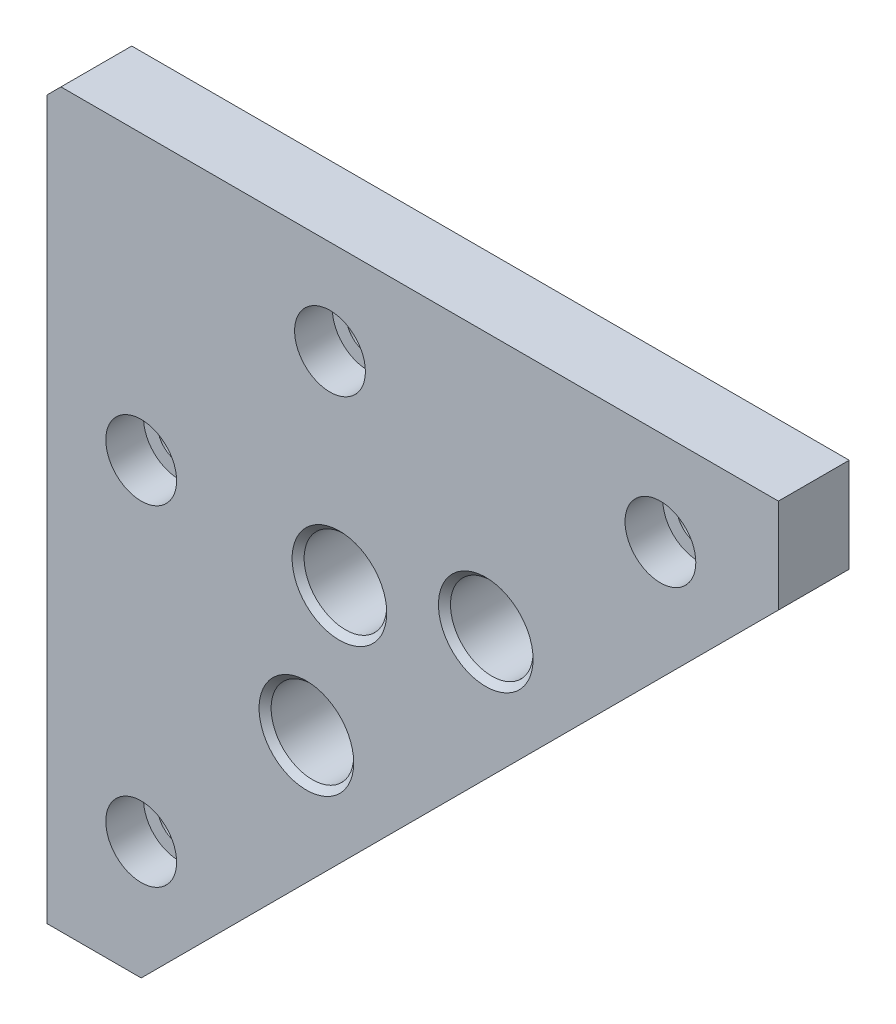
ISO-10303-21;
HEADER;
FILE_DESCRIPTION(('STEP AP214'),'2;1');
FILE_NAME('part.step','',(''),(''),'','','');
FILE_SCHEMA(('AUTOMOTIVE_DESIGN { 1 0 10303 214 1 1 1 1 }'));
ENDSEC;
DATA;
#1=APPLICATION_CONTEXT('core data for automotive mechanical design processes');
#2=APPLICATION_PROTOCOL_DEFINITION('international standard','automotive_design',2000,#1);
#3=PRODUCT_CONTEXT('',#1,'mechanical');
#4=PRODUCT('Part','Part','',(#3));
#5=PRODUCT_RELATED_PRODUCT_CATEGORY('part','',(#4));
#6=PRODUCT_DEFINITION_FORMATION('','',#4);
#7=PRODUCT_DEFINITION_CONTEXT('part definition',#1,'design');
#8=PRODUCT_DEFINITION('design','',#6,#7);
#9=PRODUCT_DEFINITION_SHAPE('','',#8);
#10=(LENGTH_UNIT() NAMED_UNIT(*) SI_UNIT(.MILLI.,.METRE.));
#11=(NAMED_UNIT(*) PLANE_ANGLE_UNIT() SI_UNIT($,.RADIAN.));
#12=(NAMED_UNIT(*) SI_UNIT($,.STERADIAN.) SOLID_ANGLE_UNIT());
#13=UNCERTAINTY_MEASURE_WITH_UNIT(LENGTH_MEASURE(1.E-05),#10,'distance_accuracy_value','');
#14=(GEOMETRIC_REPRESENTATION_CONTEXT(3) GLOBAL_UNCERTAINTY_ASSIGNED_CONTEXT((#13)) GLOBAL_UNIT_ASSIGNED_CONTEXT((#10,
#11,#12)) REPRESENTATION_CONTEXT('',''));
#15=CARTESIAN_POINT('',(0.,0.,0.));
#16=DIRECTION('',(0.,0.,1.));
#17=DIRECTION('',(1.,0.,0.));
#18=AXIS2_PLACEMENT_3D('',#15,#16,#17);
#19=CARTESIAN_POINT('',(60.,135.,0.));
#20=DIRECTION('',(0.,0.,1.));
#21=DIRECTION('',(1.,0.,0.));
#22=AXIS2_PLACEMENT_3D('',#19,#20,#21);
#23=CYLINDRICAL_SURFACE('',#22,4.50000000000001);
#24=CARTESIAN_POINT('',(60.,135.,0.));
#25=DIRECTION('',(0.,0.,1.));
#26=DIRECTION('',(1.,0.,0.));
#27=AXIS2_PLACEMENT_3D('',#24,#25,#26);
#28=CIRCLE('',#27,4.50000000000001);
#29=CARTESIAN_POINT('',(64.5,135.,0.));
#30=VERTEX_POINT('',#29);
#31=EDGE_CURVE('E202',#30,#30,#28,.T.);
#32=ORIENTED_EDGE('',*,*,#31,.F.);
#33=EDGE_LOOP('',(#32));
#34=FACE_BOUND('',#33,.T.);
#35=CARTESIAN_POINT('',(60.,135.,7.));
#36=DIRECTION('',(0.,0.,1.));
#37=DIRECTION('',(1.,0.,0.));
#38=AXIS2_PLACEMENT_3D('',#35,#36,#37);
#39=CIRCLE('',#38,4.50000000000001);
#40=CARTESIAN_POINT('',(64.5,135.,7.));
#41=VERTEX_POINT('',#40);
#42=EDGE_CURVE('E57',#41,#41,#39,.F.);
#43=ORIENTED_EDGE('',*,*,#42,.F.);
#44=EDGE_LOOP('',(#43));
#45=FACE_BOUND('',#44,.T.);
#46=ADVANCED_FACE('F53',(#34,#45),#23,.F.);
#47=CARTESIAN_POINT('',(20.,95.,0.));
#48=DIRECTION('',(0.,0.,1.));
#49=DIRECTION('',(1.,0.,0.));
#50=AXIS2_PLACEMENT_3D('',#47,#48,#49);
#51=CYLINDRICAL_SURFACE('',#50,4.5);
#52=CARTESIAN_POINT('',(20.,95.,0.));
#53=DIRECTION('',(0.,0.,1.));
#54=DIRECTION('',(1.,0.,0.));
#55=AXIS2_PLACEMENT_3D('',#52,#53,#54);
#56=CIRCLE('',#55,4.5);
#57=CARTESIAN_POINT('',(24.5,95.,0.));
#58=VERTEX_POINT('',#57);
#59=EDGE_CURVE('E198',#58,#58,#56,.T.);
#60=ORIENTED_EDGE('',*,*,#59,.F.);
#61=EDGE_LOOP('',(#60));
#62=FACE_BOUND('',#61,.T.);
#63=CARTESIAN_POINT('',(20.,95.,7.));
#64=DIRECTION('',(0.,0.,1.));
#65=DIRECTION('',(1.,0.,0.));
#66=AXIS2_PLACEMENT_3D('',#63,#64,#65);
#67=CIRCLE('',#66,4.5);
#68=CARTESIAN_POINT('',(24.5,95.,7.));
#69=VERTEX_POINT('',#68);
#70=EDGE_CURVE('E180',#69,#69,#67,.F.);
#71=ORIENTED_EDGE('',*,*,#70,.F.);
#72=EDGE_LOOP('',(#71));
#73=FACE_BOUND('',#72,.T.);
#74=ADVANCED_FACE('F317',(#62,#73),#51,.F.);
#75=CARTESIAN_POINT('',(130.,135.,0.));
#76=DIRECTION('',(0.,0.,1.));
#77=DIRECTION('',(1.,0.,0.));
#78=AXIS2_PLACEMENT_3D('',#75,#76,#77);
#79=CYLINDRICAL_SURFACE('',#78,4.49999999999999);
#80=CARTESIAN_POINT('',(130.,135.,0.));
#81=DIRECTION('',(0.,0.,1.));
#82=DIRECTION('',(1.,0.,0.));
#83=AXIS2_PLACEMENT_3D('',#80,#81,#82);
#84=CIRCLE('',#83,4.49999999999999);
#85=CARTESIAN_POINT('',(134.5,135.,0.));
#86=VERTEX_POINT('',#85);
#87=EDGE_CURVE('E192',#86,#86,#84,.T.);
#88=ORIENTED_EDGE('',*,*,#87,.F.);
#89=EDGE_LOOP('',(#88));
#90=FACE_BOUND('',#89,.T.);
#91=CARTESIAN_POINT('',(130.,135.,7.));
#92=DIRECTION('',(0.,0.,1.));
#93=DIRECTION('',(1.,0.,0.));
#94=AXIS2_PLACEMENT_3D('',#91,#92,#93);
#95=CIRCLE('',#94,4.49999999999999);
#96=CARTESIAN_POINT('',(134.5,135.,7.));
#97=VERTEX_POINT('',#96);
#98=EDGE_CURVE('E176',#97,#97,#95,.F.);
#99=ORIENTED_EDGE('',*,*,#98,.F.);
#100=EDGE_LOOP('',(#99));
#101=FACE_BOUND('',#100,.T.);
#102=ADVANCED_FACE('F324',(#90,#101),#79,.F.);
#103=CARTESIAN_POINT('',(20.,25.,0.));
#104=DIRECTION('',(0.,0.,1.));
#105=DIRECTION('',(1.,0.,0.));
#106=AXIS2_PLACEMENT_3D('',#103,#104,#105);
#107=CYLINDRICAL_SURFACE('',#106,4.5);
#108=CARTESIAN_POINT('',(20.,25.,0.));
#109=DIRECTION('',(0.,0.,1.));
#110=DIRECTION('',(1.,0.,0.));
#111=AXIS2_PLACEMENT_3D('',#108,#109,#110);
#112=CIRCLE('',#111,4.5);
#113=CARTESIAN_POINT('',(24.5,25.,0.));
#114=VERTEX_POINT('',#113);
#115=EDGE_CURVE('E187',#114,#114,#112,.T.);
#116=ORIENTED_EDGE('',*,*,#115,.F.);
#117=EDGE_LOOP('',(#116));
#118=FACE_BOUND('',#117,.T.);
#119=CARTESIAN_POINT('',(20.,25.,7.));
#120=DIRECTION('',(0.,0.,1.));
#121=DIRECTION('',(1.,0.,0.));
#122=AXIS2_PLACEMENT_3D('',#119,#120,#121);
#123=CIRCLE('',#122,4.5);
#124=CARTESIAN_POINT('',(24.5,25.,7.));
#125=VERTEX_POINT('',#124);
#126=EDGE_CURVE('E172',#125,#125,#123,.F.);
#127=ORIENTED_EDGE('',*,*,#126,.F.);
#128=EDGE_LOOP('',(#127));
#129=FACE_BOUND('',#128,.T.);
#130=ADVANCED_FACE('F331',(#118,#129),#107,.F.);
#131=CARTESIAN_POINT('',(0.,0.,15.));
#132=DIRECTION('',(1.,0.,0.));
#133=DIRECTION('',(0.,0.,-1.));
#134=AXIS2_PLACEMENT_3D('',#131,#132,#133);
#135=PLANE('',#134);
#136=DIRECTION('',(0.,-1.,0.));
#137=VECTOR('',#136,1.);
#138=CARTESIAN_POINT('',(0.,0.,0.));
#139=LINE('',#138,#137);
#140=CARTESIAN_POINT('',(0.,152.,0.));
#141=VERTEX_POINT('',#140);
#142=CARTESIAN_POINT('',(0.,0.,0.));
#143=VERTEX_POINT('',#142);
#144=EDGE_CURVE('E145',#141,#143,#139,.T.);
#145=ORIENTED_EDGE('',*,*,#144,.T.);
#146=DIRECTION('',(0.,0.,-1.));
#147=VECTOR('',#146,1.);
#148=CARTESIAN_POINT('',(0.,0.,15.));
#149=LINE('',#148,#147);
#150=CARTESIAN_POINT('',(0.,0.,15.));
#151=VERTEX_POINT('',#150);
#152=EDGE_CURVE('E11',#151,#143,#149,.T.);
#153=ORIENTED_EDGE('',*,*,#152,.F.);
#154=DIRECTION('',(0.,-1.,0.));
#155=VECTOR('',#154,1.);
#156=CARTESIAN_POINT('',(0.,0.,15.));
#157=LINE('',#156,#155);
#158=CARTESIAN_POINT('',(0.,152.,15.));
#159=VERTEX_POINT('',#158);
#160=EDGE_CURVE('E162',#159,#151,#157,.T.);
#161=ORIENTED_EDGE('',*,*,#160,.F.);
#162=DIRECTION('',(0.,0.,-1.));
#163=VECTOR('',#162,1.);
#164=CARTESIAN_POINT('',(0.,152.,15.));
#165=LINE('',#164,#163);
#166=EDGE_CURVE('E141',#159,#141,#165,.T.);
#167=ORIENTED_EDGE('',*,*,#166,.T.);
#168=EDGE_LOOP('',(#145,#153,#161,#167));
#169=FACE_BOUND('',#168,.T.);
#170=ADVANCED_FACE('F55',(#169),#135,.F.);
#171=CARTESIAN_POINT('',(0.,0.,15.));
#172=DIRECTION('',(0.,1.,0.));
#173=DIRECTION('',(0.,0.,1.));
#174=AXIS2_PLACEMENT_3D('',#171,#172,#173);
#175=PLANE('',#174);
#176=DIRECTION('',(1.,0.,0.));
#177=VECTOR('',#176,1.);
#178=CARTESIAN_POINT('',(0.,0.,0.));
#179=LINE('',#178,#177);
#180=CARTESIAN_POINT('',(20.,0.,0.));
#181=VERTEX_POINT('',#180);
#182=EDGE_CURVE('E149',#143,#181,#179,.T.);
#183=ORIENTED_EDGE('',*,*,#182,.T.);
#184=DIRECTION('',(0.,0.,-1.));
#185=VECTOR('',#184,1.);
#186=CARTESIAN_POINT('',(20.,0.,15.));
#187=LINE('',#186,#185);
#188=CARTESIAN_POINT('',(20.,0.,15.));
#189=VERTEX_POINT('',#188);
#190=EDGE_CURVE('E64',#189,#181,#187,.T.);
#191=ORIENTED_EDGE('',*,*,#190,.F.);
#192=DIRECTION('',(1.,0.,0.));
#193=VECTOR('',#192,1.);
#194=CARTESIAN_POINT('',(0.,0.,15.));
#195=LINE('',#194,#193);
#196=EDGE_CURVE('E110',#151,#189,#195,.T.);
#197=ORIENTED_EDGE('',*,*,#196,.F.);
#198=ORIENTED_EDGE('',*,*,#152,.T.);
#199=EDGE_LOOP('',(#183,#191,#197,#198));
#200=FACE_BOUND('',#199,.T.);
#201=ADVANCED_FACE('F446',(#200),#175,.F.);
#202=CARTESIAN_POINT('',(155.,135.,15.));
#203=DIRECTION('',(-0.707106781186547,0.707106781186547,0.));
#204=DIRECTION('',(-0.707106781186548,-0.707106781186548,0.));
#205=AXIS2_PLACEMENT_3D('',#202,#203,#204);
#206=PLANE('',#205);
#207=DIRECTION('',(0.707106781186548,0.707106781186548,0.));
#208=VECTOR('',#207,1.);
#209=CARTESIAN_POINT('',(155.,135.,0.));
#210=LINE('',#209,#208);
#211=CARTESIAN_POINT('',(155.,135.,0.));
#212=VERTEX_POINT('',#211);
#213=EDGE_CURVE('E153',#181,#212,#210,.T.);
#214=ORIENTED_EDGE('',*,*,#213,.T.);
#215=DIRECTION('',(0.,0.,-1.));
#216=VECTOR('',#215,1.);
#217=CARTESIAN_POINT('',(155.,135.,15.));
#218=LINE('',#217,#216);
#219=CARTESIAN_POINT('',(155.,135.,15.));
#220=VERTEX_POINT('',#219);
#221=EDGE_CURVE('E134',#220,#212,#218,.T.);
#222=ORIENTED_EDGE('',*,*,#221,.F.);
#223=DIRECTION('',(0.707106781186548,0.707106781186548,0.));
#224=VECTOR('',#223,1.);
#225=CARTESIAN_POINT('',(155.,135.,15.));
#226=LINE('',#225,#224);
#227=EDGE_CURVE('E123',#189,#220,#226,.T.);
#228=ORIENTED_EDGE('',*,*,#227,.F.);
#229=ORIENTED_EDGE('',*,*,#190,.T.);
#230=EDGE_LOOP('',(#214,#222,#228,#229));
#231=FACE_BOUND('',#230,.T.);
#232=ADVANCED_FACE('F437',(#231),#206,.F.);
#233=CARTESIAN_POINT('',(155.,135.,15.));
#234=DIRECTION('',(-1.,0.,0.));
#235=DIRECTION('',(0.,0.,1.));
#236=AXIS2_PLACEMENT_3D('',#233,#234,#235);
#237=PLANE('',#236);
#238=DIRECTION('',(0.,1.,0.));
#239=VECTOR('',#238,1.);
#240=CARTESIAN_POINT('',(155.,135.,0.));
#241=LINE('',#240,#239);
#242=CARTESIAN_POINT('',(155.,155.,0.));
#243=VERTEX_POINT('',#242);
#244=EDGE_CURVE('E132',#212,#243,#241,.T.);
#245=ORIENTED_EDGE('',*,*,#244,.T.);
#246=DIRECTION('',(0.,0.,-1.));
#247=VECTOR('',#246,1.);
#248=CARTESIAN_POINT('',(155.,155.,15.));
#249=LINE('',#248,#247);
#250=CARTESIAN_POINT('',(155.,155.,15.));
#251=VERTEX_POINT('',#250);
#252=EDGE_CURVE('E129',#251,#243,#249,.T.);
#253=ORIENTED_EDGE('',*,*,#252,.F.);
#254=DIRECTION('',(0.,1.,0.));
#255=VECTOR('',#254,1.);
#256=CARTESIAN_POINT('',(155.,135.,15.));
#257=LINE('',#256,#255);
#258=EDGE_CURVE('E117',#220,#251,#257,.T.);
#259=ORIENTED_EDGE('',*,*,#258,.F.);
#260=ORIENTED_EDGE('',*,*,#221,.T.);
#261=EDGE_LOOP('',(#245,#253,#259,#260));
#262=FACE_BOUND('',#261,.T.);
#263=ADVANCED_FACE('F130',(#262),#237,.F.);
#264=CARTESIAN_POINT('',(3.,155.,15.));
#265=DIRECTION('',(0.,-1.,0.));
#266=DIRECTION('',(0.,0.,-1.));
#267=AXIS2_PLACEMENT_3D('',#264,#265,#266);
#268=PLANE('',#267);
#269=DIRECTION('',(-1.,0.,0.));
#270=VECTOR('',#269,1.);
#271=CARTESIAN_POINT('',(3.,155.,0.));
#272=LINE('',#271,#270);
#273=CARTESIAN_POINT('',(3.,155.,0.));
#274=VERTEX_POINT('',#273);
#275=EDGE_CURVE('E96',#243,#274,#272,.T.);
#276=ORIENTED_EDGE('',*,*,#275,.T.);
#277=DIRECTION('',(0.,0.,-1.));
#278=VECTOR('',#277,1.);
#279=CARTESIAN_POINT('',(3.,155.,15.));
#280=LINE('',#279,#278);
#281=CARTESIAN_POINT('',(3.,155.,15.));
#282=VERTEX_POINT('',#281);
#283=EDGE_CURVE('E135',#282,#274,#280,.T.);
#284=ORIENTED_EDGE('',*,*,#283,.F.);
#285=DIRECTION('',(-1.,0.,0.));
#286=VECTOR('',#285,1.);
#287=CARTESIAN_POINT('',(3.,155.,15.));
#288=LINE('',#287,#286);
#289=EDGE_CURVE('E121',#251,#282,#288,.T.);
#290=ORIENTED_EDGE('',*,*,#289,.F.);
#291=ORIENTED_EDGE('',*,*,#252,.T.);
#292=EDGE_LOOP('',(#276,#284,#290,#291));
#293=FACE_BOUND('',#292,.T.);
#294=ADVANCED_FACE('F137',(#293),#268,.F.);
#295=CARTESIAN_POINT('',(0.,152.,15.));
#296=DIRECTION('',(0.707106781186548,-0.707106781186547,0.));
#297=DIRECTION('',(0.707106781186547,0.707106781186548,0.));
#298=AXIS2_PLACEMENT_3D('',#295,#296,#297);
#299=PLANE('',#298);
#300=DIRECTION('',(-0.707106781186547,-0.707106781186548,0.));
#301=VECTOR('',#300,1.);
#302=CARTESIAN_POINT('',(0.,152.,0.));
#303=LINE('',#302,#301);
#304=EDGE_CURVE('E102',#274,#141,#303,.T.);
#305=ORIENTED_EDGE('',*,*,#304,.T.);
#306=ORIENTED_EDGE('',*,*,#166,.F.);
#307=DIRECTION('',(-0.707106781186547,-0.707106781186548,0.));
#308=VECTOR('',#307,1.);
#309=CARTESIAN_POINT('',(0.,152.,15.));
#310=LINE('',#309,#308);
#311=EDGE_CURVE('E73',#282,#159,#310,.T.);
#312=ORIENTED_EDGE('',*,*,#311,.F.);
#313=ORIENTED_EDGE('',*,*,#283,.T.);
#314=EDGE_LOOP('',(#305,#306,#312,#313));
#315=FACE_BOUND('',#314,.T.);
#316=ADVANCED_FACE('F287',(#315),#299,.F.);
#317=CARTESIAN_POINT('',(0.,0.,15.));
#318=DIRECTION('',(0.,0.,-1.));
#319=DIRECTION('',(-1.,0.,0.));
#320=AXIS2_PLACEMENT_3D('',#317,#318,#319);
#321=PLANE('',#320);
#322=CARTESIAN_POINT('',(130.,135.,15.));
#323=DIRECTION('',(0.,0.,1.));
#324=DIRECTION('',(1.,0.,0.));
#325=AXIS2_PLACEMENT_3D('',#322,#323,#324);
#326=CIRCLE('',#325,7.50000000000001);
#327=CARTESIAN_POINT('',(137.5,135.,15.));
#328=VERTEX_POINT('',#327);
#329=EDGE_CURVE('E262',#328,#328,#326,.T.);
#330=ORIENTED_EDGE('',*,*,#329,.F.);
#331=EDGE_LOOP('',(#330));
#332=FACE_BOUND('',#331,.T.);
#333=CARTESIAN_POINT('',(60.,135.,15.));
#334=DIRECTION('',(0.,0.,1.));
#335=DIRECTION('',(1.,0.,0.));
#336=AXIS2_PLACEMENT_3D('',#333,#334,#335);
#337=CIRCLE('',#336,7.5);
#338=CARTESIAN_POINT('',(67.5,135.,15.));
#339=VERTEX_POINT('',#338);
#340=EDGE_CURVE('E270',#339,#339,#337,.T.);
#341=ORIENTED_EDGE('',*,*,#340,.F.);
#342=EDGE_LOOP('',(#341));
#343=FACE_BOUND('',#342,.T.);
#344=CARTESIAN_POINT('',(20.,25.,15.));
#345=DIRECTION('',(0.,0.,1.));
#346=DIRECTION('',(1.,0.,0.));
#347=AXIS2_PLACEMENT_3D('',#344,#345,#346);
#348=CIRCLE('',#347,7.5);
#349=CARTESIAN_POINT('',(27.5,25.,15.));
#350=VERTEX_POINT('',#349);
#351=EDGE_CURVE('E254',#350,#350,#348,.T.);
#352=ORIENTED_EDGE('',*,*,#351,.F.);
#353=EDGE_LOOP('',(#352));
#354=FACE_BOUND('',#353,.T.);
#355=CARTESIAN_POINT('',(20.,95.,15.));
#356=DIRECTION('',(0.,0.,1.));
#357=DIRECTION('',(1.,0.,0.));
#358=AXIS2_PLACEMENT_3D('',#355,#356,#357);
#359=CIRCLE('',#358,7.5);
#360=CARTESIAN_POINT('',(27.5,95.,15.));
#361=VERTEX_POINT('',#360);
#362=EDGE_CURVE('E250',#361,#361,#359,.T.);
#363=ORIENTED_EDGE('',*,*,#362,.F.);
#364=EDGE_LOOP('',(#363));
#365=FACE_BOUND('',#364,.T.);
#366=CARTESIAN_POINT('',(62.,93.,15.));
#367=DIRECTION('',(0.,0.,1.));
#368=DIRECTION('',(1.,0.,0.));
#369=AXIS2_PLACEMENT_3D('',#366,#367,#368);
#370=CIRCLE('',#369,10.025);
#371=CARTESIAN_POINT('',(72.025,93.,15.));
#372=VERTEX_POINT('',#371);
#373=EDGE_CURVE('E206',#372,#372,#370,.T.);
#374=ORIENTED_EDGE('',*,*,#373,.F.);
#375=EDGE_LOOP('',(#374));
#376=FACE_BOUND('',#375,.T.);
#377=CARTESIAN_POINT('',(55.,62.,15.));
#378=DIRECTION('',(0.,0.,1.));
#379=DIRECTION('',(1.,0.,0.));
#380=AXIS2_PLACEMENT_3D('',#377,#378,#379);
#381=CIRCLE('',#380,10.025);
#382=CARTESIAN_POINT('',(65.025,62.,15.));
#383=VERTEX_POINT('',#382);
#384=EDGE_CURVE('E218',#383,#383,#381,.T.);
#385=ORIENTED_EDGE('',*,*,#384,.F.);
#386=EDGE_LOOP('',(#385));
#387=FACE_BOUND('',#386,.T.);
#388=CARTESIAN_POINT('',(93.,100.,15.));
#389=DIRECTION('',(0.,0.,1.));
#390=DIRECTION('',(1.,0.,0.));
#391=AXIS2_PLACEMENT_3D('',#388,#389,#390);
#392=CIRCLE('',#391,10.025);
#393=CARTESIAN_POINT('',(103.025,100.,15.));
#394=VERTEX_POINT('',#393);
#395=EDGE_CURVE('E230',#394,#394,#392,.T.);
#396=ORIENTED_EDGE('',*,*,#395,.F.);
#397=EDGE_LOOP('',(#396));
#398=FACE_BOUND('',#397,.T.);
#399=ORIENTED_EDGE('',*,*,#160,.T.);
#400=ORIENTED_EDGE('',*,*,#196,.T.);
#401=ORIENTED_EDGE('',*,*,#227,.T.);
#402=ORIENTED_EDGE('',*,*,#258,.T.);
#403=ORIENTED_EDGE('',*,*,#289,.T.);
#404=ORIENTED_EDGE('',*,*,#311,.T.);
#405=EDGE_LOOP('',(#399,#400,#401,#402,#403,#404));
#406=FACE_BOUND('',#405,.T.);
#407=ADVANCED_FACE('F119',(#332,#343,#354,#365,#376,#387,#398,#406),#321,.F.);
#408=CARTESIAN_POINT('',(0.,0.,0.));
#409=DIRECTION('',(0.,0.,-1.));
#410=DIRECTION('',(-1.,0.,0.));
#411=AXIS2_PLACEMENT_3D('',#408,#409,#410);
#412=PLANE('',#411);
#413=ORIENTED_EDGE('',*,*,#115,.T.);
#414=EDGE_LOOP('',(#413));
#415=FACE_BOUND('',#414,.T.);
#416=ORIENTED_EDGE('',*,*,#87,.T.);
#417=EDGE_LOOP('',(#416));
#418=FACE_BOUND('',#417,.T.);
#419=ORIENTED_EDGE('',*,*,#59,.T.);
#420=EDGE_LOOP('',(#419));
#421=FACE_BOUND('',#420,.T.);
#422=ORIENTED_EDGE('',*,*,#31,.T.);
#423=EDGE_LOOP('',(#422));
#424=FACE_BOUND('',#423,.T.);
#425=CARTESIAN_POINT('',(62.,93.,0.));
#426=DIRECTION('',(0.,0.,1.));
#427=DIRECTION('',(1.,0.,0.));
#428=AXIS2_PLACEMENT_3D('',#425,#426,#427);
#429=CIRCLE('',#428,8.74999999999999);
#430=CARTESIAN_POINT('',(70.75,93.,0.));
#431=VERTEX_POINT('',#430);
#432=EDGE_CURVE('E214',#431,#431,#429,.T.);
#433=ORIENTED_EDGE('',*,*,#432,.T.);
#434=EDGE_LOOP('',(#433));
#435=FACE_BOUND('',#434,.T.);
#436=CARTESIAN_POINT('',(55.,62.,0.));
#437=DIRECTION('',(0.,0.,1.));
#438=DIRECTION('',(1.,0.,0.));
#439=AXIS2_PLACEMENT_3D('',#436,#437,#438);
#440=CIRCLE('',#439,8.75);
#441=CARTESIAN_POINT('',(63.75,62.,0.));
#442=VERTEX_POINT('',#441);
#443=EDGE_CURVE('E226',#442,#442,#440,.T.);
#444=ORIENTED_EDGE('',*,*,#443,.T.);
#445=EDGE_LOOP('',(#444));
#446=FACE_BOUND('',#445,.T.);
#447=CARTESIAN_POINT('',(93.,100.,0.));
#448=DIRECTION('',(0.,0.,1.));
#449=DIRECTION('',(1.,0.,0.));
#450=AXIS2_PLACEMENT_3D('',#447,#448,#449);
#451=CIRCLE('',#450,8.74999999999999);
#452=CARTESIAN_POINT('',(101.75,100.,0.));
#453=VERTEX_POINT('',#452);
#454=EDGE_CURVE('E150',#453,#453,#451,.T.);
#455=ORIENTED_EDGE('',*,*,#454,.T.);
#456=EDGE_LOOP('',(#455));
#457=FACE_BOUND('',#456,.T.);
#458=ORIENTED_EDGE('',*,*,#144,.F.);
#459=ORIENTED_EDGE('',*,*,#304,.F.);
#460=ORIENTED_EDGE('',*,*,#275,.F.);
#461=ORIENTED_EDGE('',*,*,#244,.F.);
#462=ORIENTED_EDGE('',*,*,#213,.F.);
#463=ORIENTED_EDGE('',*,*,#182,.F.);
#464=EDGE_LOOP('',(#458,#459,#460,#461,#462,#463));
#465=FACE_BOUND('',#464,.T.);
#466=ADVANCED_FACE('F286',(#415,#418,#421,#424,#435,#446,#457,#465),#412,.T.);
#467=CARTESIAN_POINT('',(93.,100.,15.));
#468=DIRECTION('',(0.,0.,1.));
#469=DIRECTION('',(1.,0.,0.));
#470=AXIS2_PLACEMENT_3D('',#467,#468,#469);
#471=CYLINDRICAL_SURFACE('',#470,8.74999999999999);
#472=ORIENTED_EDGE('',*,*,#454,.F.);
#473=EDGE_LOOP('',(#472));
#474=FACE_BOUND('',#473,.T.);
#475=CARTESIAN_POINT('',(93.,100.,13.725));
#476=DIRECTION('',(0.,0.,1.));
#477=DIRECTION('',(1.,0.,0.));
#478=AXIS2_PLACEMENT_3D('',#475,#476,#477);
#479=CIRCLE('',#478,8.74999999999999);
#480=CARTESIAN_POINT('',(101.75,100.,13.725));
#481=VERTEX_POINT('',#480);
#482=EDGE_CURVE('E234',#481,#481,#479,.T.);
#483=ORIENTED_EDGE('',*,*,#482,.T.);
#484=EDGE_LOOP('',(#483));
#485=FACE_BOUND('',#484,.T.);
#486=ADVANCED_FACE('F301',(#474,#485),#471,.F.);
#487=CARTESIAN_POINT('',(93.,100.,15.));
#488=DIRECTION('',(0.,0.,1.));
#489=DIRECTION('',(1.,0.,0.));
#490=AXIS2_PLACEMENT_3D('',#487,#488,#489);
#491=CONICAL_SURFACE('',#490,10.025,0.785398163397452);
#492=ORIENTED_EDGE('',*,*,#482,.F.);
#493=EDGE_LOOP('',(#492));
#494=FACE_BOUND('',#493,.T.);
#495=ORIENTED_EDGE('',*,*,#395,.T.);
#496=EDGE_LOOP('',(#495));
#497=FACE_BOUND('',#496,.T.);
#498=ADVANCED_FACE('F298',(#494,#497),#491,.F.);
#499=CARTESIAN_POINT('',(55.,62.,15.));
#500=DIRECTION('',(0.,0.,1.));
#501=DIRECTION('',(1.,0.,0.));
#502=AXIS2_PLACEMENT_3D('',#499,#500,#501);
#503=CYLINDRICAL_SURFACE('',#502,8.75);
#504=ORIENTED_EDGE('',*,*,#443,.F.);
#505=EDGE_LOOP('',(#504));
#506=FACE_BOUND('',#505,.T.);
#507=CARTESIAN_POINT('',(55.,62.,13.725));
#508=DIRECTION('',(0.,0.,1.));
#509=DIRECTION('',(1.,0.,0.));
#510=AXIS2_PLACEMENT_3D('',#507,#508,#509);
#511=CIRCLE('',#510,8.75);
#512=CARTESIAN_POINT('',(63.75,62.,13.725));
#513=VERTEX_POINT('',#512);
#514=EDGE_CURVE('E222',#513,#513,#511,.T.);
#515=ORIENTED_EDGE('',*,*,#514,.T.);
#516=EDGE_LOOP('',(#515));
#517=FACE_BOUND('',#516,.T.);
#518=ADVANCED_FACE('F300',(#506,#517),#503,.F.);
#519=CARTESIAN_POINT('',(55.,62.,15.));
#520=DIRECTION('',(0.,0.,1.));
#521=DIRECTION('',(1.,0.,0.));
#522=AXIS2_PLACEMENT_3D('',#519,#520,#521);
#523=CONICAL_SURFACE('',#522,10.025,0.785398163397446);
#524=ORIENTED_EDGE('',*,*,#514,.F.);
#525=EDGE_LOOP('',(#524));
#526=FACE_BOUND('',#525,.T.);
#527=ORIENTED_EDGE('',*,*,#384,.T.);
#528=EDGE_LOOP('',(#527));
#529=FACE_BOUND('',#528,.T.);
#530=ADVANCED_FACE('F309',(#526,#529),#523,.F.);
#531=CARTESIAN_POINT('',(62.,93.,15.));
#532=DIRECTION('',(0.,0.,1.));
#533=DIRECTION('',(1.,0.,0.));
#534=AXIS2_PLACEMENT_3D('',#531,#532,#533);
#535=CYLINDRICAL_SURFACE('',#534,8.74999999999999);
#536=ORIENTED_EDGE('',*,*,#432,.F.);
#537=EDGE_LOOP('',(#536));
#538=FACE_BOUND('',#537,.T.);
#539=CARTESIAN_POINT('',(62.,93.,13.725));
#540=DIRECTION('',(0.,0.,1.));
#541=DIRECTION('',(1.,0.,0.));
#542=AXIS2_PLACEMENT_3D('',#539,#540,#541);
#543=CIRCLE('',#542,8.74999999999999);
#544=CARTESIAN_POINT('',(70.75,93.,13.725));
#545=VERTEX_POINT('',#544);
#546=EDGE_CURVE('E210',#545,#545,#543,.T.);
#547=ORIENTED_EDGE('',*,*,#546,.T.);
#548=EDGE_LOOP('',(#547));
#549=FACE_BOUND('',#548,.T.);
#550=ADVANCED_FACE('F337',(#538,#549),#535,.F.);
#551=CARTESIAN_POINT('',(62.,93.,15.));
#552=DIRECTION('',(0.,0.,1.));
#553=DIRECTION('',(1.,0.,0.));
#554=AXIS2_PLACEMENT_3D('',#551,#552,#553);
#555=CONICAL_SURFACE('',#554,10.025,0.785398163397452);
#556=ORIENTED_EDGE('',*,*,#546,.F.);
#557=EDGE_LOOP('',(#556));
#558=FACE_BOUND('',#557,.T.);
#559=ORIENTED_EDGE('',*,*,#373,.T.);
#560=EDGE_LOOP('',(#559));
#561=FACE_BOUND('',#560,.T.);
#562=ADVANCED_FACE('F333',(#558,#561),#555,.F.);
#563=CARTESIAN_POINT('',(20.,25.,7.));
#564=DIRECTION('',(0.,0.,1.));
#565=DIRECTION('',(1.,0.,0.));
#566=AXIS2_PLACEMENT_3D('',#563,#564,#565);
#567=PLANE('',#566);
#568=CARTESIAN_POINT('',(20.,25.,7.));
#569=DIRECTION('',(0.,0.,1.));
#570=DIRECTION('',(1.,0.,0.));
#571=AXIS2_PLACEMENT_3D('',#568,#569,#570);
#572=CIRCLE('',#571,7.5);
#573=CARTESIAN_POINT('',(27.5,25.,7.));
#574=VERTEX_POINT('',#573);
#575=EDGE_CURVE('E274',#574,#574,#572,.T.);
#576=ORIENTED_EDGE('',*,*,#575,.T.);
#577=EDGE_LOOP('',(#576));
#578=FACE_BOUND('',#577,.T.);
#579=ORIENTED_EDGE('',*,*,#126,.T.);
#580=EDGE_LOOP('',(#579));
#581=FACE_BOUND('',#580,.T.);
#582=ADVANCED_FACE('F336',(#578,#581),#567,.T.);
#583=CARTESIAN_POINT('',(20.,25.,7.));
#584=DIRECTION('',(0.,0.,1.));
#585=DIRECTION('',(1.,0.,0.));
#586=AXIS2_PLACEMENT_3D('',#583,#584,#585);
#587=CYLINDRICAL_SURFACE('',#586,7.5);
#588=ORIENTED_EDGE('',*,*,#575,.F.);
#589=EDGE_LOOP('',(#588));
#590=FACE_BOUND('',#589,.T.);
#591=ORIENTED_EDGE('',*,*,#351,.T.);
#592=EDGE_LOOP('',(#591));
#593=FACE_BOUND('',#592,.T.);
#594=ADVANCED_FACE('F282',(#590,#593),#587,.F.);
#595=CARTESIAN_POINT('',(130.,135.,7.));
#596=DIRECTION('',(0.,0.,1.));
#597=DIRECTION('',(1.,0.,0.));
#598=AXIS2_PLACEMENT_3D('',#595,#596,#597);
#599=PLANE('',#598);
#600=CARTESIAN_POINT('',(130.,135.,7.));
#601=DIRECTION('',(0.,0.,1.));
#602=DIRECTION('',(1.,0.,0.));
#603=AXIS2_PLACEMENT_3D('',#600,#601,#602);
#604=CIRCLE('',#603,7.50000000000001);
#605=CARTESIAN_POINT('',(137.5,135.,7.));
#606=VERTEX_POINT('',#605);
#607=EDGE_CURVE('E258',#606,#606,#604,.T.);
#608=ORIENTED_EDGE('',*,*,#607,.T.);
#609=EDGE_LOOP('',(#608));
#610=FACE_BOUND('',#609,.T.);
#611=ORIENTED_EDGE('',*,*,#98,.T.);
#612=EDGE_LOOP('',(#611));
#613=FACE_BOUND('',#612,.T.);
#614=ADVANCED_FACE('F483',(#610,#613),#599,.T.);
#615=CARTESIAN_POINT('',(130.,135.,7.));
#616=DIRECTION('',(0.,0.,1.));
#617=DIRECTION('',(1.,0.,0.));
#618=AXIS2_PLACEMENT_3D('',#615,#616,#617);
#619=CYLINDRICAL_SURFACE('',#618,7.50000000000001);
#620=ORIENTED_EDGE('',*,*,#607,.F.);
#621=EDGE_LOOP('',(#620));
#622=FACE_BOUND('',#621,.T.);
#623=ORIENTED_EDGE('',*,*,#329,.T.);
#624=EDGE_LOOP('',(#623));
#625=FACE_BOUND('',#624,.T.);
#626=ADVANCED_FACE('F496',(#622,#625),#619,.F.);
#627=CARTESIAN_POINT('',(20.,95.,7.));
#628=DIRECTION('',(0.,0.,1.));
#629=DIRECTION('',(1.,0.,0.));
#630=AXIS2_PLACEMENT_3D('',#627,#628,#629);
#631=PLANE('',#630);
#632=CARTESIAN_POINT('',(20.,95.,7.));
#633=DIRECTION('',(0.,0.,1.));
#634=DIRECTION('',(1.,0.,0.));
#635=AXIS2_PLACEMENT_3D('',#632,#633,#634);
#636=CIRCLE('',#635,7.5);
#637=CARTESIAN_POINT('',(27.5,95.,7.));
#638=VERTEX_POINT('',#637);
#639=EDGE_CURVE('E177',#638,#638,#636,.T.);
#640=ORIENTED_EDGE('',*,*,#639,.T.);
#641=EDGE_LOOP('',(#640));
#642=FACE_BOUND('',#641,.T.);
#643=ORIENTED_EDGE('',*,*,#70,.T.);
#644=EDGE_LOOP('',(#643));
#645=FACE_BOUND('',#644,.T.);
#646=ADVANCED_FACE('F499',(#642,#645),#631,.T.);
#647=CARTESIAN_POINT('',(20.,95.,7.));
#648=DIRECTION('',(0.,0.,1.));
#649=DIRECTION('',(1.,0.,0.));
#650=AXIS2_PLACEMENT_3D('',#647,#648,#649);
#651=CYLINDRICAL_SURFACE('',#650,7.5);
#652=ORIENTED_EDGE('',*,*,#639,.F.);
#653=EDGE_LOOP('',(#652));
#654=FACE_BOUND('',#653,.T.);
#655=ORIENTED_EDGE('',*,*,#362,.T.);
#656=EDGE_LOOP('',(#655));
#657=FACE_BOUND('',#656,.T.);
#658=ADVANCED_FACE('F494',(#654,#657),#651,.F.);
#659=CARTESIAN_POINT('',(60.,135.,7.));
#660=DIRECTION('',(0.,0.,1.));
#661=DIRECTION('',(1.,0.,0.));
#662=AXIS2_PLACEMENT_3D('',#659,#660,#661);
#663=PLANE('',#662);
#664=CARTESIAN_POINT('',(60.,135.,7.));
#665=DIRECTION('',(0.,0.,1.));
#666=DIRECTION('',(1.,0.,0.));
#667=AXIS2_PLACEMENT_3D('',#664,#665,#666);
#668=CIRCLE('',#667,7.5);
#669=CARTESIAN_POINT('',(67.5,135.,7.));
#670=VERTEX_POINT('',#669);
#671=EDGE_CURVE('E266',#670,#670,#668,.T.);
#672=ORIENTED_EDGE('',*,*,#671,.T.);
#673=EDGE_LOOP('',(#672));
#674=FACE_BOUND('',#673,.T.);
#675=ORIENTED_EDGE('',*,*,#42,.T.);
#676=EDGE_LOOP('',(#675));
#677=FACE_BOUND('',#676,.T.);
#678=ADVANCED_FACE('F490',(#674,#677),#663,.T.);
#679=CARTESIAN_POINT('',(60.,135.,7.));
#680=DIRECTION('',(0.,0.,1.));
#681=DIRECTION('',(1.,0.,0.));
#682=AXIS2_PLACEMENT_3D('',#679,#680,#681);
#683=CYLINDRICAL_SURFACE('',#682,7.5);
#684=ORIENTED_EDGE('',*,*,#671,.F.);
#685=EDGE_LOOP('',(#684));
#686=FACE_BOUND('',#685,.T.);
#687=ORIENTED_EDGE('',*,*,#340,.T.);
#688=EDGE_LOOP('',(#687));
#689=FACE_BOUND('',#688,.T.);
#690=ADVANCED_FACE('F487',(#686,#689),#683,.F.);
#691=CLOSED_SHELL('',(#46,#74,#102,#130,#170,#201,#232,#263,#294,#316,#407,#466,#486,#498,#518,
#530,#550,#562,#582,#594,#614,#626,#646,#658,#678,#690));
#692=MANIFOLD_SOLID_BREP('B2',#691);
#693=ADVANCED_BREP_SHAPE_REPRESENTATION('',(#18,#692),#14);
#694=SHAPE_DEFINITION_REPRESENTATION(#9,#693);
ENDSEC;
END-ISO-10303-21;
